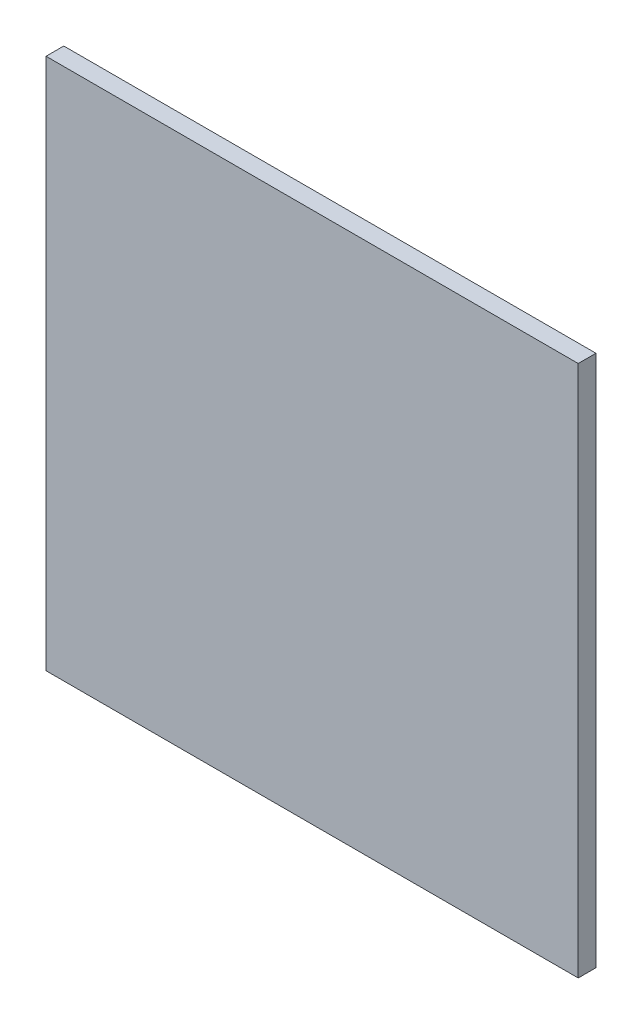
ISO-10303-21;
HEADER;
FILE_DESCRIPTION(('STEP AP214'),'2;1');
FILE_NAME('part.step','',(''),(''),'','','');
FILE_SCHEMA(('AUTOMOTIVE_DESIGN { 1 0 10303 214 1 1 1 1 }'));
ENDSEC;
DATA;
#1=APPLICATION_CONTEXT('core data for automotive mechanical design processes');
#2=APPLICATION_PROTOCOL_DEFINITION('international standard','automotive_design',2000,#1);
#3=PRODUCT_CONTEXT('',#1,'mechanical');
#4=PRODUCT('Part','Part','',(#3));
#5=PRODUCT_RELATED_PRODUCT_CATEGORY('part','',(#4));
#6=PRODUCT_DEFINITION_FORMATION('','',#4);
#7=PRODUCT_DEFINITION_CONTEXT('part definition',#1,'design');
#8=PRODUCT_DEFINITION('design','',#6,#7);
#9=PRODUCT_DEFINITION_SHAPE('','',#8);
#10=(LENGTH_UNIT() NAMED_UNIT(*) SI_UNIT(.MILLI.,.METRE.));
#11=(NAMED_UNIT(*) PLANE_ANGLE_UNIT() SI_UNIT($,.RADIAN.));
#12=(NAMED_UNIT(*) SI_UNIT($,.STERADIAN.) SOLID_ANGLE_UNIT());
#13=UNCERTAINTY_MEASURE_WITH_UNIT(LENGTH_MEASURE(1.E-05),#10,'distance_accuracy_value','');
#14=(GEOMETRIC_REPRESENTATION_CONTEXT(3) GLOBAL_UNCERTAINTY_ASSIGNED_CONTEXT((#13)) GLOBAL_UNIT_ASSIGNED_CONTEXT((#10,
#11,#12)) REPRESENTATION_CONTEXT('',''));
#15=CARTESIAN_POINT('',(0.,0.,0.));
#16=DIRECTION('',(0.,0.,1.));
#17=DIRECTION('',(1.,0.,0.));
#18=AXIS2_PLACEMENT_3D('',#15,#16,#17);
#19=CARTESIAN_POINT('',(7.5,7.5,0.5));
#20=DIRECTION('',(-1.,0.,0.));
#21=DIRECTION('',(0.,-1.,0.));
#22=AXIS2_PLACEMENT_3D('',#19,#20,#21);
#23=PLANE('',#22);
#24=DIRECTION('',(0.,1.,0.));
#25=VECTOR('',#24,1.);
#26=CARTESIAN_POINT('',(7.5,7.5,0.));
#27=LINE('',#26,#25);
#28=CARTESIAN_POINT('',(7.5,-7.5,0.));
#29=VERTEX_POINT('',#28);
#30=CARTESIAN_POINT('',(7.5,7.5,0.));
#31=VERTEX_POINT('',#30);
#32=EDGE_CURVE('E96',#29,#31,#27,.T.);
#33=ORIENTED_EDGE('',*,*,#32,.T.);
#34=DIRECTION('',(0.,0.,-1.));
#35=VECTOR('',#34,1.);
#36=CARTESIAN_POINT('',(7.5,7.5,0.5));
#37=LINE('',#36,#35);
#38=CARTESIAN_POINT('',(7.5,7.5,0.5));
#39=VERTEX_POINT('',#38);
#40=EDGE_CURVE('E11',#39,#31,#37,.T.);
#41=ORIENTED_EDGE('',*,*,#40,.F.);
#42=DIRECTION('',(0.,1.,0.));
#43=VECTOR('',#42,1.);
#44=CARTESIAN_POINT('',(7.5,7.5,0.5));
#45=LINE('',#44,#43);
#46=CARTESIAN_POINT('',(7.5,-7.5,0.5));
#47=VERTEX_POINT('',#46);
#48=EDGE_CURVE('E84',#47,#39,#45,.T.);
#49=ORIENTED_EDGE('',*,*,#48,.F.);
#50=DIRECTION('',(0.,0.,-1.));
#51=VECTOR('',#50,1.);
#52=CARTESIAN_POINT('',(7.5,-7.5,0.5));
#53=LINE('',#52,#51);
#54=EDGE_CURVE('E92',#47,#29,#53,.T.);
#55=ORIENTED_EDGE('',*,*,#54,.T.);
#56=EDGE_LOOP('',(#33,#41,#49,#55));
#57=FACE_BOUND('',#56,.T.);
#58=ADVANCED_FACE('F33',(#57),#23,.F.);
#59=CARTESIAN_POINT('',(-7.5,7.5,0.5));
#60=DIRECTION('',(0.,-1.,0.));
#61=DIRECTION('',(0.,0.,-1.));
#62=AXIS2_PLACEMENT_3D('',#59,#60,#61);
#63=PLANE('',#62);
#64=DIRECTION('',(-1.,0.,0.));
#65=VECTOR('',#64,1.);
#66=CARTESIAN_POINT('',(-7.5,7.5,0.));
#67=LINE('',#66,#65);
#68=CARTESIAN_POINT('',(-7.5,7.5,0.));
#69=VERTEX_POINT('',#68);
#70=EDGE_CURVE('E88',#31,#69,#67,.T.);
#71=ORIENTED_EDGE('',*,*,#70,.T.);
#72=DIRECTION('',(0.,0.,-1.));
#73=VECTOR('',#72,1.);
#74=CARTESIAN_POINT('',(-7.5,7.5,0.5));
#75=LINE('',#74,#73);
#76=CARTESIAN_POINT('',(-7.5,7.5,0.5));
#77=VERTEX_POINT('',#76);
#78=EDGE_CURVE('E41',#77,#69,#75,.T.);
#79=ORIENTED_EDGE('',*,*,#78,.F.);
#80=DIRECTION('',(-1.,0.,0.));
#81=VECTOR('',#80,1.);
#82=CARTESIAN_POINT('',(-7.5,7.5,0.5));
#83=LINE('',#82,#81);
#84=EDGE_CURVE('E79',#39,#77,#83,.T.);
#85=ORIENTED_EDGE('',*,*,#84,.F.);
#86=ORIENTED_EDGE('',*,*,#40,.T.);
#87=EDGE_LOOP('',(#71,#79,#85,#86));
#88=FACE_BOUND('',#87,.T.);
#89=ADVANCED_FACE('F87',(#88),#63,.F.);
#90=CARTESIAN_POINT('',(-7.5,7.5,0.5));
#91=DIRECTION('',(1.,0.,0.));
#92=DIRECTION('',(0.,1.,0.));
#93=AXIS2_PLACEMENT_3D('',#90,#91,#92);
#94=PLANE('',#93);
#95=DIRECTION('',(0.,-1.,0.));
#96=VECTOR('',#95,1.);
#97=CARTESIAN_POINT('',(-7.5,7.5,0.));
#98=LINE('',#97,#96);
#99=CARTESIAN_POINT('',(-7.5,-7.5,0.));
#100=VERTEX_POINT('',#99);
#101=EDGE_CURVE('E66',#69,#100,#98,.T.);
#102=ORIENTED_EDGE('',*,*,#101,.T.);
#103=DIRECTION('',(0.,0.,-1.));
#104=VECTOR('',#103,1.);
#105=CARTESIAN_POINT('',(-7.5,-7.5,0.5));
#106=LINE('',#105,#104);
#107=CARTESIAN_POINT('',(-7.5,-7.5,0.5));
#108=VERTEX_POINT('',#107);
#109=EDGE_CURVE('E89',#108,#100,#106,.T.);
#110=ORIENTED_EDGE('',*,*,#109,.F.);
#111=DIRECTION('',(0.,-1.,0.));
#112=VECTOR('',#111,1.);
#113=CARTESIAN_POINT('',(-7.5,7.5,0.5));
#114=LINE('',#113,#112);
#115=EDGE_CURVE('E82',#77,#108,#114,.T.);
#116=ORIENTED_EDGE('',*,*,#115,.F.);
#117=ORIENTED_EDGE('',*,*,#78,.T.);
#118=EDGE_LOOP('',(#102,#110,#116,#117));
#119=FACE_BOUND('',#118,.T.);
#120=ADVANCED_FACE('F90',(#119),#94,.F.);
#121=CARTESIAN_POINT('',(-7.5,-7.5,0.5));
#122=DIRECTION('',(0.,1.,0.));
#123=DIRECTION('',(0.,0.,1.));
#124=AXIS2_PLACEMENT_3D('',#121,#122,#123);
#125=PLANE('',#124);
#126=DIRECTION('',(1.,0.,0.));
#127=VECTOR('',#126,1.);
#128=CARTESIAN_POINT('',(-7.5,-7.5,0.));
#129=LINE('',#128,#127);
#130=EDGE_CURVE('E72',#100,#29,#129,.T.);
#131=ORIENTED_EDGE('',*,*,#130,.T.);
#132=ORIENTED_EDGE('',*,*,#54,.F.);
#133=DIRECTION('',(1.,0.,0.));
#134=VECTOR('',#133,1.);
#135=CARTESIAN_POINT('',(-7.5,-7.5,0.5));
#136=LINE('',#135,#134);
#137=EDGE_CURVE('E49',#108,#47,#136,.T.);
#138=ORIENTED_EDGE('',*,*,#137,.F.);
#139=ORIENTED_EDGE('',*,*,#109,.T.);
#140=EDGE_LOOP('',(#131,#132,#138,#139));
#141=FACE_BOUND('',#140,.T.);
#142=ADVANCED_FACE('F103',(#141),#125,.F.);
#143=CARTESIAN_POINT('',(0.,0.,0.5));
#144=DIRECTION('',(0.,0.,1.));
#145=DIRECTION('',(1.,0.,0.));
#146=AXIS2_PLACEMENT_3D('',#143,#144,#145);
#147=PLANE('',#146);
#148=ORIENTED_EDGE('',*,*,#48,.T.);
#149=ORIENTED_EDGE('',*,*,#84,.T.);
#150=ORIENTED_EDGE('',*,*,#115,.T.);
#151=ORIENTED_EDGE('',*,*,#137,.T.);
#152=EDGE_LOOP('',(#148,#149,#150,#151));
#153=FACE_BOUND('',#152,.T.);
#154=ADVANCED_FACE('F80',(#153),#147,.T.);
#155=CARTESIAN_POINT('',(0.,0.,0.));
#156=DIRECTION('',(0.,0.,1.));
#157=DIRECTION('',(1.,0.,0.));
#158=AXIS2_PLACEMENT_3D('',#155,#156,#157);
#159=PLANE('',#158);
#160=ORIENTED_EDGE('',*,*,#32,.F.);
#161=ORIENTED_EDGE('',*,*,#130,.F.);
#162=ORIENTED_EDGE('',*,*,#101,.F.);
#163=ORIENTED_EDGE('',*,*,#70,.F.);
#164=EDGE_LOOP('',(#160,#161,#162,#163));
#165=FACE_BOUND('',#164,.T.);
#166=ADVANCED_FACE('F106',(#165),#159,.F.);
#167=CLOSED_SHELL('',(#58,#89,#120,#142,#154,#166));
#168=MANIFOLD_SOLID_BREP('B2',#167);
#169=ADVANCED_BREP_SHAPE_REPRESENTATION('',(#18,#168),#14);
#170=SHAPE_DEFINITION_REPRESENTATION(#9,#169);
ENDSEC;
END-ISO-10303-21;
